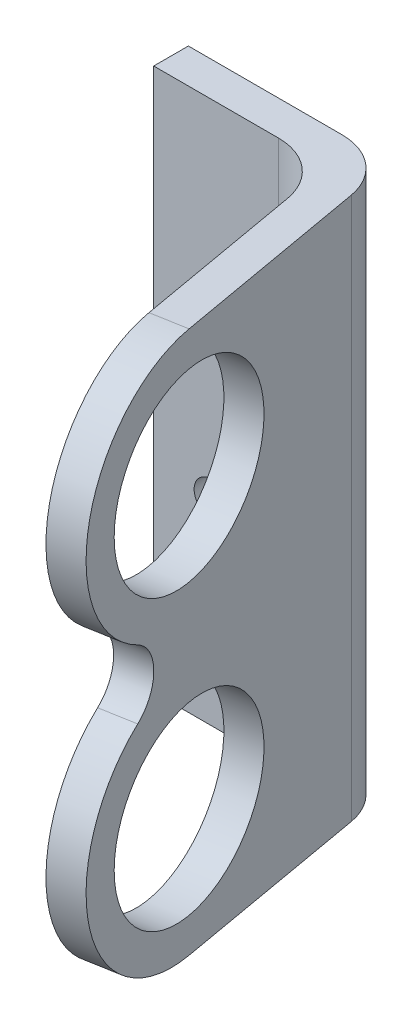
ISO-10303-21;
HEADER;
FILE_DESCRIPTION(('STEP AP214'),'2;1');
FILE_NAME('part.step','',(''),(''),'','','');
FILE_SCHEMA(('AUTOMOTIVE_DESIGN { 1 0 10303 214 1 1 1 1 }'));
ENDSEC;
DATA;
#1=APPLICATION_CONTEXT('core data for automotive mechanical design processes');
#2=APPLICATION_PROTOCOL_DEFINITION('international standard','automotive_design',2000,#1);
#3=PRODUCT_CONTEXT('',#1,'mechanical');
#4=PRODUCT('Part','Part','',(#3));
#5=PRODUCT_RELATED_PRODUCT_CATEGORY('part','',(#4));
#6=PRODUCT_DEFINITION_FORMATION('','',#4);
#7=PRODUCT_DEFINITION_CONTEXT('part definition',#1,'design');
#8=PRODUCT_DEFINITION('design','',#6,#7);
#9=PRODUCT_DEFINITION_SHAPE('','',#8);
#10=(LENGTH_UNIT() NAMED_UNIT(*) SI_UNIT(.MILLI.,.METRE.));
#11=(NAMED_UNIT(*) PLANE_ANGLE_UNIT() SI_UNIT($,.RADIAN.));
#12=(NAMED_UNIT(*) SI_UNIT($,.STERADIAN.) SOLID_ANGLE_UNIT());
#13=UNCERTAINTY_MEASURE_WITH_UNIT(LENGTH_MEASURE(1.E-05),#10,'distance_accuracy_value','');
#14=(GEOMETRIC_REPRESENTATION_CONTEXT(3) GLOBAL_UNCERTAINTY_ASSIGNED_CONTEXT((#13)) GLOBAL_UNIT_ASSIGNED_CONTEXT((#10,
#11,#12)) REPRESENTATION_CONTEXT('',''));
#15=CARTESIAN_POINT('',(0.,0.,0.));
#16=DIRECTION('',(0.,0.,1.));
#17=DIRECTION('',(1.,0.,0.));
#18=AXIS2_PLACEMENT_3D('',#15,#16,#17);
#19=CARTESIAN_POINT('',(17.8888455699224,47.,21.630774973123));
#20=DIRECTION('',(0.984807753012209,0.,-0.173648177666927));
#21=DIRECTION('',(-0.173648177666927,0.,-0.984807753012209));
#22=AXIS2_PLACEMENT_3D('',#19,#20,#21);
#23=PLANE('',#22);
#24=CARTESIAN_POINT('',(15.9787156155862,36.,10.7978896899887));
#25=DIRECTION('',(-0.984807753012209,0.,0.173648177666927));
#26=DIRECTION('',(0.173648177666927,0.,0.984807753012209));
#27=AXIS2_PLACEMENT_3D('',#24,#25,#26);
#28=CIRCLE('',#27,8.);
#29=CARTESIAN_POINT('',(17.3679010369217,36.,18.6763517140864));
#30=VERTEX_POINT('',#29);
#31=EDGE_CURVE('E230',#30,#30,#28,.T.);
#32=ORIENTED_EDGE('',*,*,#31,.F.);
#33=EDGE_LOOP('',(#32));
#34=FACE_BOUND('',#33,.T.);
#35=CARTESIAN_POINT('',(15.9787156155862,11.,10.7978896899887));
#36=DIRECTION('',(-0.984807753012209,0.,0.173648177666927));
#37=DIRECTION('',(0.173648177666927,0.,0.984807753012209));
#38=AXIS2_PLACEMENT_3D('',#35,#36,#37);
#39=CIRCLE('',#38,8.);
#40=CARTESIAN_POINT('',(17.3679010369217,11.,18.6763517140864));
#41=VERTEX_POINT('',#40);
#42=EDGE_CURVE('E223',#41,#41,#39,.T.);
#43=ORIENTED_EDGE('',*,*,#42,.F.);
#44=EDGE_LOOP('',(#43));
#45=FACE_BOUND('',#44,.T.);
#46=CARTESIAN_POINT('',(17.227766400431,23.5,17.8816086978581));
#47=DIRECTION('',(-0.984807753012209,0.,0.173648177666927));
#48=DIRECTION('',(0.173648177666927,0.,0.984807753012209));
#49=AXIS2_PLACEMENT_3D('',#46,#47,#48);
#50=CIRCLE('',#49,3.42183077301811);
#51=CARTESIAN_POINT('',(16.9314073264748,20.5341570820017,16.2008728696517));
#52=VERTEX_POINT('',#51);
#53=CARTESIAN_POINT('',(16.9314073264748,26.4658429179983,16.2008728696517));
#54=VERTEX_POINT('',#53);
#55=EDGE_CURVE('E221',#52,#54,#50,.F.);
#56=ORIENTED_EDGE('',*,*,#55,.T.);
#57=CARTESIAN_POINT('',(15.9787156155862,36.,10.7978896899887));
#58=DIRECTION('',(-0.984807753012209,0.,0.173648177666927));
#59=DIRECTION('',(0.173648177666927,0.,0.984807753012209));
#60=AXIS2_PLACEMENT_3D('',#57,#58,#59);
#61=CIRCLE('',#60,11.);
#62=CARTESIAN_POINT('',(15.9787156155862,47.,10.7978896899887));
#63=VERTEX_POINT('',#62);
#64=EDGE_CURVE('E206',#54,#63,#61,.T.);
#65=ORIENTED_EDGE('',*,*,#64,.T.);
#66=DIRECTION('',(0.173648177666927,0.,0.984807753012209));
#67=VECTOR('',#66,1.);
#68=CARTESIAN_POINT('',(17.8888455699224,47.,21.630774973123));
#69=LINE('',#68,#67);
#70=CARTESIAN_POINT('',(13.4079408490893,47.,-3.78169850557787));
#71=VERTEX_POINT('',#70);
#72=EDGE_CURVE('E259',#71,#63,#69,.T.);
#73=ORIENTED_EDGE('',*,*,#72,.F.);
#74=DIRECTION('',(0.,-1.,0.));
#75=VECTOR('',#74,1.);
#76=CARTESIAN_POINT('',(13.4079408490893,47.,-3.78169850557787));
#77=LINE('',#76,#75);
#78=CARTESIAN_POINT('',(13.4079408490893,0.,-3.78169850557787));
#79=VERTEX_POINT('',#78);
#80=EDGE_CURVE('E289',#71,#79,#77,.T.);
#81=ORIENTED_EDGE('',*,*,#80,.T.);
#82=DIRECTION('',(0.173648177666927,0.,0.984807753012209));
#83=VECTOR('',#82,1.);
#84=CARTESIAN_POINT('',(17.8888455699224,0.,21.630774973123));
#85=LINE('',#84,#83);
#86=CARTESIAN_POINT('',(15.9787156155862,0.,10.7978896899887));
#87=VERTEX_POINT('',#86);
#88=EDGE_CURVE('E274',#79,#87,#85,.T.);
#89=ORIENTED_EDGE('',*,*,#88,.T.);
#90=CARTESIAN_POINT('',(15.9787156155862,11.,10.7978896899887));
#91=DIRECTION('',(-0.984807753012209,0.,0.173648177666927));
#92=DIRECTION('',(0.173648177666927,0.,0.984807753012209));
#93=AXIS2_PLACEMENT_3D('',#90,#91,#92);
#94=CIRCLE('',#93,11.);
#95=EDGE_CURVE('E146',#87,#52,#94,.T.);
#96=ORIENTED_EDGE('',*,*,#95,.T.);
#97=EDGE_LOOP('',(#56,#65,#73,#81,#89,#96));
#98=FACE_BOUND('',#97,.T.);
#99=ADVANCED_FACE('F130',(#34,#45,#98),#23,.F.);
#100=CARTESIAN_POINT('',(15.9252397426211,47.,-6.78169850557787));
#101=DIRECTION('',(-0.984807753012208,0.,0.173648177666928));
#102=DIRECTION('',(0.173648177666928,0.,0.984807753012209));
#103=AXIS2_PLACEMENT_3D('',#100,#101,#102);
#104=PLANE('',#103);
#105=CARTESIAN_POINT('',(18.9331388746229,36.,10.2769451569879));
#106=DIRECTION('',(-0.984807753012208,0.,0.173648177666928));
#107=DIRECTION('',(0.173648177666928,0.,0.984807753012209));
#108=AXIS2_PLACEMENT_3D('',#105,#106,#107);
#109=CIRCLE('',#108,8.);
#110=CARTESIAN_POINT('',(20.3223242959583,36.,18.1554071810856));
#111=VERTEX_POINT('',#110);
#112=EDGE_CURVE('E134',#111,#111,#109,.T.);
#113=ORIENTED_EDGE('',*,*,#112,.T.);
#114=EDGE_LOOP('',(#113));
#115=FACE_BOUND('',#114,.T.);
#116=CARTESIAN_POINT('',(18.9331388746229,11.,10.2769451569879));
#117=DIRECTION('',(-0.984807753012208,0.,0.173648177666928));
#118=DIRECTION('',(0.173648177666928,0.,0.984807753012209));
#119=AXIS2_PLACEMENT_3D('',#116,#117,#118);
#120=CIRCLE('',#119,8.);
#121=CARTESIAN_POINT('',(20.3223242959583,11.,18.1554071810856));
#122=VERTEX_POINT('',#121);
#123=EDGE_CURVE('E215',#122,#122,#120,.T.);
#124=ORIENTED_EDGE('',*,*,#123,.T.);
#125=EDGE_LOOP('',(#124));
#126=FACE_BOUND('',#125,.T.);
#127=CARTESIAN_POINT('',(18.9331388746229,36.,10.2769451569879));
#128=DIRECTION('',(-0.984807753012208,0.,0.173648177666928));
#129=DIRECTION('',(0.173648177666928,0.,0.984807753012209));
#130=AXIS2_PLACEMENT_3D('',#127,#128,#129);
#131=CIRCLE('',#130,11.);
#132=CARTESIAN_POINT('',(19.8858305855114,26.4658429179983,15.679928336651));
#133=VERTEX_POINT('',#132);
#134=CARTESIAN_POINT('',(18.9331388746229,47.,10.2769451569879));
#135=VERTEX_POINT('',#134);
#136=EDGE_CURVE('E154',#133,#135,#131,.T.);
#137=ORIENTED_EDGE('',*,*,#136,.F.);
#138=CARTESIAN_POINT('',(20.1821896594676,23.5,17.3606641648573));
#139=DIRECTION('',(-0.984807753012208,0.,0.173648177666928));
#140=DIRECTION('',(0.173648177666928,0.,0.984807753012209));
#141=AXIS2_PLACEMENT_3D('',#138,#139,#140);
#142=CIRCLE('',#141,3.42183077301811);
#143=CARTESIAN_POINT('',(19.8858305855114,20.5341570820017,15.679928336651));
#144=VERTEX_POINT('',#143);
#145=EDGE_CURVE('E12',#144,#133,#142,.F.);
#146=ORIENTED_EDGE('',*,*,#145,.F.);
#147=CARTESIAN_POINT('',(18.9331388746229,11.,10.2769451569879));
#148=DIRECTION('',(-0.984807753012208,0.,0.173648177666928));
#149=DIRECTION('',(0.173648177666928,0.,0.984807753012209));
#150=AXIS2_PLACEMENT_3D('',#147,#148,#149);
#151=CIRCLE('',#150,11.);
#152=CARTESIAN_POINT('',(18.9331388746229,0.,10.2769451569879));
#153=VERTEX_POINT('',#152);
#154=EDGE_CURVE('E235',#153,#144,#151,.T.);
#155=ORIENTED_EDGE('',*,*,#154,.F.);
#156=DIRECTION('',(-0.173648177666928,0.,-0.984807753012209));
#157=VECTOR('',#156,1.);
#158=CARTESIAN_POINT('',(15.9252397426211,0.,-6.78169850557787));
#159=LINE('',#158,#157);
#160=CARTESIAN_POINT('',(15.9252397426211,0.,-6.78169850557787));
#161=VERTEX_POINT('',#160);
#162=EDGE_CURVE('E276',#153,#161,#159,.T.);
#163=ORIENTED_EDGE('',*,*,#162,.T.);
#164=DIRECTION('',(0.,-1.,0.));
#165=VECTOR('',#164,1.);
#166=CARTESIAN_POINT('',(15.9252397426211,47.,-6.78169850557787));
#167=LINE('',#166,#165);
#168=CARTESIAN_POINT('',(15.9252397426211,47.,-6.78169850557787));
#169=VERTEX_POINT('',#168);
#170=EDGE_CURVE('E286',#169,#161,#167,.T.);
#171=ORIENTED_EDGE('',*,*,#170,.F.);
#172=DIRECTION('',(-0.173648177666928,0.,-0.984807753012209));
#173=VECTOR('',#172,1.);
#174=CARTESIAN_POINT('',(15.9252397426211,47.,-6.78169850557787));
#175=LINE('',#174,#173);
#176=EDGE_CURVE('E261',#135,#169,#175,.T.);
#177=ORIENTED_EDGE('',*,*,#176,.F.);
#178=EDGE_LOOP('',(#137,#146,#155,#163,#171,#177));
#179=FACE_BOUND('',#178,.T.);
#180=ADVANCED_FACE('F303',(#115,#126,#179),#104,.F.);
#181=CARTESIAN_POINT('',(-2.32059976008538,47.,-7.91345761724326));
#182=DIRECTION('',(1.,0.,0.));
#183=DIRECTION('',(0.,0.,-1.));
#184=AXIS2_PLACEMENT_3D('',#181,#182,#183);
#185=PLANE('',#184);
#186=DIRECTION('',(0.,0.,1.));
#187=VECTOR('',#186,1.);
#188=CARTESIAN_POINT('',(-2.32059976008538,0.,-7.91345761724326));
#189=LINE('',#188,#187);
#190=CARTESIAN_POINT('',(-2.32059976008538,0.,-10.9134576172433));
#191=VERTEX_POINT('',#190);
#192=CARTESIAN_POINT('',(-2.32059976008538,0.,-7.91345761724326));
#193=VERTEX_POINT('',#192);
#194=EDGE_CURVE('E248',#191,#193,#189,.T.);
#195=ORIENTED_EDGE('',*,*,#194,.T.);
#196=DIRECTION('',(0.,-1.,0.));
#197=VECTOR('',#196,1.);
#198=CARTESIAN_POINT('',(-2.32059976008538,47.,-7.91345761724326));
#199=LINE('',#198,#197);
#200=CARTESIAN_POINT('',(-2.32059976008538,47.,-7.91345761724326));
#201=VERTEX_POINT('',#200);
#202=EDGE_CURVE('E295',#201,#193,#199,.T.);
#203=ORIENTED_EDGE('',*,*,#202,.F.);
#204=DIRECTION('',(0.,0.,1.));
#205=VECTOR('',#204,1.);
#206=CARTESIAN_POINT('',(-2.32059976008538,47.,-7.91345761724326));
#207=LINE('',#206,#205);
#208=CARTESIAN_POINT('',(-2.32059976008538,47.,-10.9134576172433));
#209=VERTEX_POINT('',#208);
#210=EDGE_CURVE('E251',#209,#201,#207,.T.);
#211=ORIENTED_EDGE('',*,*,#210,.F.);
#212=DIRECTION('',(0.,-1.,0.));
#213=VECTOR('',#212,1.);
#214=CARTESIAN_POINT('',(-2.32059976008538,47.,-10.9134576172433));
#215=LINE('',#214,#213);
#216=EDGE_CURVE('E267',#209,#191,#215,.T.);
#217=ORIENTED_EDGE('',*,*,#216,.T.);
#218=EDGE_LOOP('',(#195,#203,#211,#217));
#219=FACE_BOUND('',#218,.T.);
#220=ADVANCED_FACE('F132',(#219),#185,.F.);
#221=CARTESIAN_POINT('',(8.48390208402817,47.,-7.91345761724326));
#222=DIRECTION('',(0.,0.,-1.));
#223=DIRECTION('',(-1.,0.,0.));
#224=AXIS2_PLACEMENT_3D('',#221,#222,#223);
#225=PLANE('',#224);
#226=CARTESIAN_POINT('',(2.67940023991462,17.,-7.91345761724326));
#227=DIRECTION('',(0.,0.,1.));
#228=DIRECTION('',(1.,0.,0.));
#229=AXIS2_PLACEMENT_3D('',#226,#227,#228);
#230=CIRCLE('',#229,1.5);
#231=CARTESIAN_POINT('',(4.17940023991462,17.,-7.91345761724326));
#232=VERTEX_POINT('',#231);
#233=EDGE_CURVE('E238',#232,#232,#230,.T.);
#234=ORIENTED_EDGE('',*,*,#233,.F.);
#235=EDGE_LOOP('',(#234));
#236=FACE_BOUND('',#235,.T.);
#237=CARTESIAN_POINT('',(2.67940023991462,30.,-7.91345761724326));
#238=DIRECTION('',(0.,0.,1.));
#239=DIRECTION('',(1.,0.,0.));
#240=AXIS2_PLACEMENT_3D('',#237,#238,#239);
#241=CIRCLE('',#240,1.5);
#242=CARTESIAN_POINT('',(4.17940023991462,30.,-7.91345761724326));
#243=VERTEX_POINT('',#242);
#244=EDGE_CURVE('E242',#243,#243,#241,.T.);
#245=ORIENTED_EDGE('',*,*,#244,.F.);
#246=EDGE_LOOP('',(#245));
#247=FACE_BOUND('',#246,.T.);
#248=DIRECTION('',(1.,0.,0.));
#249=VECTOR('',#248,1.);
#250=CARTESIAN_POINT('',(8.48390208402817,0.,-7.91345761724326));
#251=LINE('',#250,#249);
#252=CARTESIAN_POINT('',(8.48390208402817,0.,-7.91345761724326));
#253=VERTEX_POINT('',#252);
#254=EDGE_CURVE('E270',#193,#253,#251,.T.);
#255=ORIENTED_EDGE('',*,*,#254,.T.);
#256=DIRECTION('',(0.,-1.,0.));
#257=VECTOR('',#256,1.);
#258=CARTESIAN_POINT('',(8.48390208402817,47.,-7.91345761724326));
#259=LINE('',#258,#257);
#260=CARTESIAN_POINT('',(8.48390208402817,47.,-7.91345761724326));
#261=VERTEX_POINT('',#260);
#262=EDGE_CURVE('E292',#261,#253,#259,.T.);
#263=ORIENTED_EDGE('',*,*,#262,.F.);
#264=DIRECTION('',(1.,0.,0.));
#265=VECTOR('',#264,1.);
#266=CARTESIAN_POINT('',(8.48390208402817,47.,-7.91345761724326));
#267=LINE('',#266,#265);
#268=EDGE_CURVE('E254',#201,#261,#267,.T.);
#269=ORIENTED_EDGE('',*,*,#268,.F.);
#270=ORIENTED_EDGE('',*,*,#202,.T.);
#271=EDGE_LOOP('',(#255,#263,#269,#270));
#272=FACE_BOUND('',#271,.T.);
#273=ADVANCED_FACE('F333',(#236,#247,#272),#225,.F.);
#274=CARTESIAN_POINT('',(8.4839020840282,47.,-2.91345761724326));
#275=DIRECTION('',(0.,-1.,0.));
#276=DIRECTION('',(0.,0.,-1.));
#277=AXIS2_PLACEMENT_3D('',#274,#275,#276);
#278=CYLINDRICAL_SURFACE('',#277,5.);
#279=CARTESIAN_POINT('',(8.4839020840282,0.,-2.91345761724326));
#280=DIRECTION('',(0.,-1.,0.));
#281=DIRECTION('',(0.,0.,1.));
#282=AXIS2_PLACEMENT_3D('',#279,#280,#281);
#283=CIRCLE('',#282,5.);
#284=EDGE_CURVE('E272',#253,#79,#283,.T.);
#285=ORIENTED_EDGE('',*,*,#284,.T.);
#286=ORIENTED_EDGE('',*,*,#80,.F.);
#287=CARTESIAN_POINT('',(8.4839020840282,47.,-2.91345761724326));
#288=DIRECTION('',(0.,-1.,0.));
#289=DIRECTION('',(0.,0.,1.));
#290=AXIS2_PLACEMENT_3D('',#287,#288,#289);
#291=CIRCLE('',#290,5.);
#292=EDGE_CURVE('E257',#261,#71,#291,.T.);
#293=ORIENTED_EDGE('',*,*,#292,.F.);
#294=ORIENTED_EDGE('',*,*,#262,.T.);
#295=EDGE_LOOP('',(#285,#286,#293,#294));
#296=FACE_BOUND('',#295,.T.);
#297=ADVANCED_FACE('F330',(#296),#278,.F.);
#298=CARTESIAN_POINT('',(11.00120097756,47.,-5.91345761724326));
#299=DIRECTION('',(0.,-1.,0.));
#300=DIRECTION('',(0.,0.,-1.));
#301=AXIS2_PLACEMENT_3D('',#298,#299,#300);
#302=CYLINDRICAL_SURFACE('',#301,5.);
#303=CARTESIAN_POINT('',(11.00120097756,0.,-5.91345761724326));
#304=DIRECTION('',(0.,1.,0.));
#305=DIRECTION('',(0.,0.,1.));
#306=AXIS2_PLACEMENT_3D('',#303,#304,#305);
#307=CIRCLE('',#306,5.);
#308=CARTESIAN_POINT('',(11.00120097756,0.,-10.9134576172433));
#309=VERTEX_POINT('',#308);
#310=EDGE_CURVE('E278',#161,#309,#307,.T.);
#311=ORIENTED_EDGE('',*,*,#310,.T.);
#312=DIRECTION('',(0.,-1.,0.));
#313=VECTOR('',#312,1.);
#314=CARTESIAN_POINT('',(11.00120097756,47.,-10.9134576172433));
#315=LINE('',#314,#313);
#316=CARTESIAN_POINT('',(11.00120097756,47.,-10.9134576172433));
#317=VERTEX_POINT('',#316);
#318=EDGE_CURVE('E283',#317,#309,#315,.T.);
#319=ORIENTED_EDGE('',*,*,#318,.F.);
#320=CARTESIAN_POINT('',(11.00120097756,47.,-5.91345761724326));
#321=DIRECTION('',(0.,1.,0.));
#322=DIRECTION('',(0.,0.,1.));
#323=AXIS2_PLACEMENT_3D('',#320,#321,#322);
#324=CIRCLE('',#323,5.);
#325=EDGE_CURVE('E263',#169,#317,#324,.T.);
#326=ORIENTED_EDGE('',*,*,#325,.F.);
#327=ORIENTED_EDGE('',*,*,#170,.T.);
#328=EDGE_LOOP('',(#311,#319,#326,#327));
#329=FACE_BOUND('',#328,.T.);
#330=ADVANCED_FACE('F332',(#329),#302,.T.);
#331=CARTESIAN_POINT('',(-2.32059976008538,47.,-10.9134576172433));
#332=DIRECTION('',(0.,0.,1.));
#333=DIRECTION('',(1.,0.,0.));
#334=AXIS2_PLACEMENT_3D('',#331,#332,#333);
#335=PLANE('',#334);
#336=CARTESIAN_POINT('',(2.67940023991462,17.,-10.9134576172433));
#337=DIRECTION('',(0.,0.,1.));
#338=DIRECTION('',(1.,0.,0.));
#339=AXIS2_PLACEMENT_3D('',#336,#337,#338);
#340=CIRCLE('',#339,1.5);
#341=CARTESIAN_POINT('',(4.17940023991462,17.,-10.9134576172433));
#342=VERTEX_POINT('',#341);
#343=EDGE_CURVE('E239',#342,#342,#340,.T.);
#344=ORIENTED_EDGE('',*,*,#343,.T.);
#345=EDGE_LOOP('',(#344));
#346=FACE_BOUND('',#345,.T.);
#347=CARTESIAN_POINT('',(2.67940023991462,30.,-10.9134576172433));
#348=DIRECTION('',(0.,0.,1.));
#349=DIRECTION('',(1.,0.,0.));
#350=AXIS2_PLACEMENT_3D('',#347,#348,#349);
#351=CIRCLE('',#350,1.5);
#352=CARTESIAN_POINT('',(4.17940023991462,30.,-10.9134576172433));
#353=VERTEX_POINT('',#352);
#354=EDGE_CURVE('E245',#353,#353,#351,.T.);
#355=ORIENTED_EDGE('',*,*,#354,.T.);
#356=EDGE_LOOP('',(#355));
#357=FACE_BOUND('',#356,.T.);
#358=DIRECTION('',(-1.,0.,0.));
#359=VECTOR('',#358,1.);
#360=CARTESIAN_POINT('',(-2.32059976008538,0.,-10.9134576172433));
#361=LINE('',#360,#359);
#362=EDGE_CURVE('E255',#309,#191,#361,.T.);
#363=ORIENTED_EDGE('',*,*,#362,.T.);
#364=ORIENTED_EDGE('',*,*,#216,.F.);
#365=DIRECTION('',(-1.,0.,0.));
#366=VECTOR('',#365,1.);
#367=CARTESIAN_POINT('',(-2.32059976008538,47.,-10.9134576172433));
#368=LINE('',#367,#366);
#369=EDGE_CURVE('E265',#317,#209,#368,.T.);
#370=ORIENTED_EDGE('',*,*,#369,.F.);
#371=ORIENTED_EDGE('',*,*,#318,.T.);
#372=EDGE_LOOP('',(#363,#364,#370,#371));
#373=FACE_BOUND('',#372,.T.);
#374=ADVANCED_FACE('F364',(#346,#357,#373),#335,.F.);
#375=CARTESIAN_POINT('',(11.00120097756,47.,-5.91345761724326));
#376=DIRECTION('',(0.,1.,0.));
#377=DIRECTION('',(0.,0.,1.));
#378=AXIS2_PLACEMENT_3D('',#375,#376,#377);
#379=PLANE('',#378);
#380=DIRECTION('',(-0.984807753012209,0.,0.173648177666927));
#381=VECTOR('',#380,1.);
#382=CARTESIAN_POINT('',(24.4094436601924,47.,9.31132486870913));
#383=LINE('',#382,#381);
#384=EDGE_CURVE('E210',#135,#63,#383,.T.);
#385=ORIENTED_EDGE('',*,*,#384,.F.);
#386=ORIENTED_EDGE('',*,*,#176,.T.);
#387=ORIENTED_EDGE('',*,*,#325,.T.);
#388=ORIENTED_EDGE('',*,*,#369,.T.);
#389=ORIENTED_EDGE('',*,*,#210,.T.);
#390=ORIENTED_EDGE('',*,*,#268,.T.);
#391=ORIENTED_EDGE('',*,*,#292,.T.);
#392=ORIENTED_EDGE('',*,*,#72,.T.);
#393=EDGE_LOOP('',(#385,#386,#387,#388,#389,#390,#391,#392));
#394=FACE_BOUND('',#393,.T.);
#395=ADVANCED_FACE('F356',(#394),#379,.T.);
#396=CARTESIAN_POINT('',(11.00120097756,0.,-5.91345761724326));
#397=DIRECTION('',(0.,1.,0.));
#398=DIRECTION('',(0.,0.,1.));
#399=AXIS2_PLACEMENT_3D('',#396,#397,#398);
#400=PLANE('',#399);
#401=ORIENTED_EDGE('',*,*,#162,.F.);
#402=DIRECTION('',(-0.984807753012209,0.,0.173648177666927));
#403=VECTOR('',#402,1.);
#404=CARTESIAN_POINT('',(24.4094436601924,0.,9.31132486870913));
#405=LINE('',#404,#403);
#406=EDGE_CURVE('E139',#153,#87,#405,.T.);
#407=ORIENTED_EDGE('',*,*,#406,.T.);
#408=ORIENTED_EDGE('',*,*,#88,.F.);
#409=ORIENTED_EDGE('',*,*,#284,.F.);
#410=ORIENTED_EDGE('',*,*,#254,.F.);
#411=ORIENTED_EDGE('',*,*,#194,.F.);
#412=ORIENTED_EDGE('',*,*,#362,.F.);
#413=ORIENTED_EDGE('',*,*,#310,.F.);
#414=EDGE_LOOP('',(#401,#407,#408,#409,#410,#411,#412,#413));
#415=FACE_BOUND('',#414,.T.);
#416=ADVANCED_FACE('F354',(#415),#400,.F.);
#417=CARTESIAN_POINT('',(2.67940023991462,30.,-10.9134576172433));
#418=DIRECTION('',(0.,0.,1.));
#419=DIRECTION('',(1.,0.,0.));
#420=AXIS2_PLACEMENT_3D('',#417,#418,#419);
#421=CYLINDRICAL_SURFACE('',#420,1.5);
#422=ORIENTED_EDGE('',*,*,#354,.F.);
#423=EDGE_LOOP('',(#422));
#424=FACE_BOUND('',#423,.T.);
#425=ORIENTED_EDGE('',*,*,#244,.T.);
#426=EDGE_LOOP('',(#425));
#427=FACE_BOUND('',#426,.T.);
#428=ADVANCED_FACE('F379',(#424,#427),#421,.F.);
#429=CARTESIAN_POINT('',(2.67940023991462,17.,-10.9134576172433));
#430=DIRECTION('',(0.,0.,1.));
#431=DIRECTION('',(1.,0.,0.));
#432=AXIS2_PLACEMENT_3D('',#429,#430,#431);
#433=CYLINDRICAL_SURFACE('',#432,1.5);
#434=ORIENTED_EDGE('',*,*,#343,.F.);
#435=EDGE_LOOP('',(#434));
#436=FACE_BOUND('',#435,.T.);
#437=ORIENTED_EDGE('',*,*,#233,.T.);
#438=EDGE_LOOP('',(#437));
#439=FACE_BOUND('',#438,.T.);
#440=ADVANCED_FACE('F384',(#436,#439),#433,.F.);
#441=CARTESIAN_POINT('',(24.4094436601924,36.,9.31132486870913));
#442=DIRECTION('',(-0.984807753012209,0.,0.173648177666927));
#443=DIRECTION('',(0.173648177666927,0.,0.984807753012209));
#444=AXIS2_PLACEMENT_3D('',#441,#442,#443);
#445=CYLINDRICAL_SURFACE('',#444,11.);
#446=ORIENTED_EDGE('',*,*,#136,.T.);
#447=ORIENTED_EDGE('',*,*,#384,.T.);
#448=ORIENTED_EDGE('',*,*,#64,.F.);
#449=DIRECTION('',(-0.984807753012209,0.,0.173648177666927));
#450=VECTOR('',#449,1.);
#451=CARTESIAN_POINT('',(25.362135371081,26.4658429179983,14.7143080483722));
#452=LINE('',#451,#450);
#453=EDGE_CURVE('E209',#133,#54,#452,.T.);
#454=ORIENTED_EDGE('',*,*,#453,.F.);
#455=EDGE_LOOP('',(#446,#447,#448,#454));
#456=FACE_BOUND('',#455,.T.);
#457=ADVANCED_FACE('F208',(#456),#445,.T.);
#458=CARTESIAN_POINT('',(24.4094436601924,11.,9.31132486870913));
#459=DIRECTION('',(-0.984807753012209,0.,0.173648177666927));
#460=DIRECTION('',(0.173648177666927,0.,0.984807753012209));
#461=AXIS2_PLACEMENT_3D('',#458,#459,#460);
#462=CYLINDRICAL_SURFACE('',#461,11.);
#463=ORIENTED_EDGE('',*,*,#154,.T.);
#464=DIRECTION('',(-0.984807753012209,0.,0.173648177666927));
#465=VECTOR('',#464,1.);
#466=CARTESIAN_POINT('',(25.362135371081,20.5341570820017,14.7143080483722));
#467=LINE('',#466,#465);
#468=EDGE_CURVE('E224',#144,#52,#467,.T.);
#469=ORIENTED_EDGE('',*,*,#468,.T.);
#470=ORIENTED_EDGE('',*,*,#95,.F.);
#471=ORIENTED_EDGE('',*,*,#406,.F.);
#472=EDGE_LOOP('',(#463,#469,#470,#471));
#473=FACE_BOUND('',#472,.T.);
#474=ADVANCED_FACE('F308',(#473),#462,.T.);
#475=CARTESIAN_POINT('',(24.4094436601924,11.,9.31132486870913));
#476=DIRECTION('',(-0.984807753012209,0.,0.173648177666927));
#477=DIRECTION('',(0.173648177666927,0.,0.984807753012209));
#478=AXIS2_PLACEMENT_3D('',#475,#476,#477);
#479=CYLINDRICAL_SURFACE('',#478,8.);
#480=ORIENTED_EDGE('',*,*,#42,.T.);
#481=EDGE_LOOP('',(#480));
#482=FACE_BOUND('',#481,.T.);
#483=ORIENTED_EDGE('',*,*,#123,.F.);
#484=EDGE_LOOP('',(#483));
#485=FACE_BOUND('',#484,.T.);
#486=ADVANCED_FACE('F306',(#482,#485),#479,.F.);
#487=CARTESIAN_POINT('',(25.6584944450372,23.5,16.3950438765786));
#488=DIRECTION('',(-0.984807753012209,0.,0.173648177666927));
#489=DIRECTION('',(0.173648177666927,0.,0.984807753012209));
#490=AXIS2_PLACEMENT_3D('',#487,#488,#489);
#491=CYLINDRICAL_SURFACE('',#490,3.42183077301811);
#492=ORIENTED_EDGE('',*,*,#145,.T.);
#493=ORIENTED_EDGE('',*,*,#453,.T.);
#494=ORIENTED_EDGE('',*,*,#55,.F.);
#495=ORIENTED_EDGE('',*,*,#468,.F.);
#496=EDGE_LOOP('',(#492,#493,#494,#495));
#497=FACE_BOUND('',#496,.T.);
#498=ADVANCED_FACE('F219',(#497),#491,.F.);
#499=CARTESIAN_POINT('',(24.4094436601924,36.,9.31132486870913));
#500=DIRECTION('',(-0.984807753012209,0.,0.173648177666927));
#501=DIRECTION('',(0.173648177666927,0.,0.984807753012209));
#502=AXIS2_PLACEMENT_3D('',#499,#500,#501);
#503=CYLINDRICAL_SURFACE('',#502,8.);
#504=ORIENTED_EDGE('',*,*,#31,.T.);
#505=EDGE_LOOP('',(#504));
#506=FACE_BOUND('',#505,.T.);
#507=ORIENTED_EDGE('',*,*,#112,.F.);
#508=EDGE_LOOP('',(#507));
#509=FACE_BOUND('',#508,.T.);
#510=ADVANCED_FACE('F315',(#506,#509),#503,.F.);
#511=CLOSED_SHELL('',(#99,#180,#220,#273,#297,#330,#374,#395,#416,#428,#440,#457,#474,#486,#498,#510));
#512=MANIFOLD_SOLID_BREP('B2',#511);
#513=ADVANCED_BREP_SHAPE_REPRESENTATION('',(#18,#512),#14);
#514=SHAPE_DEFINITION_REPRESENTATION(#9,#513);
ENDSEC;
END-ISO-10303-21;
